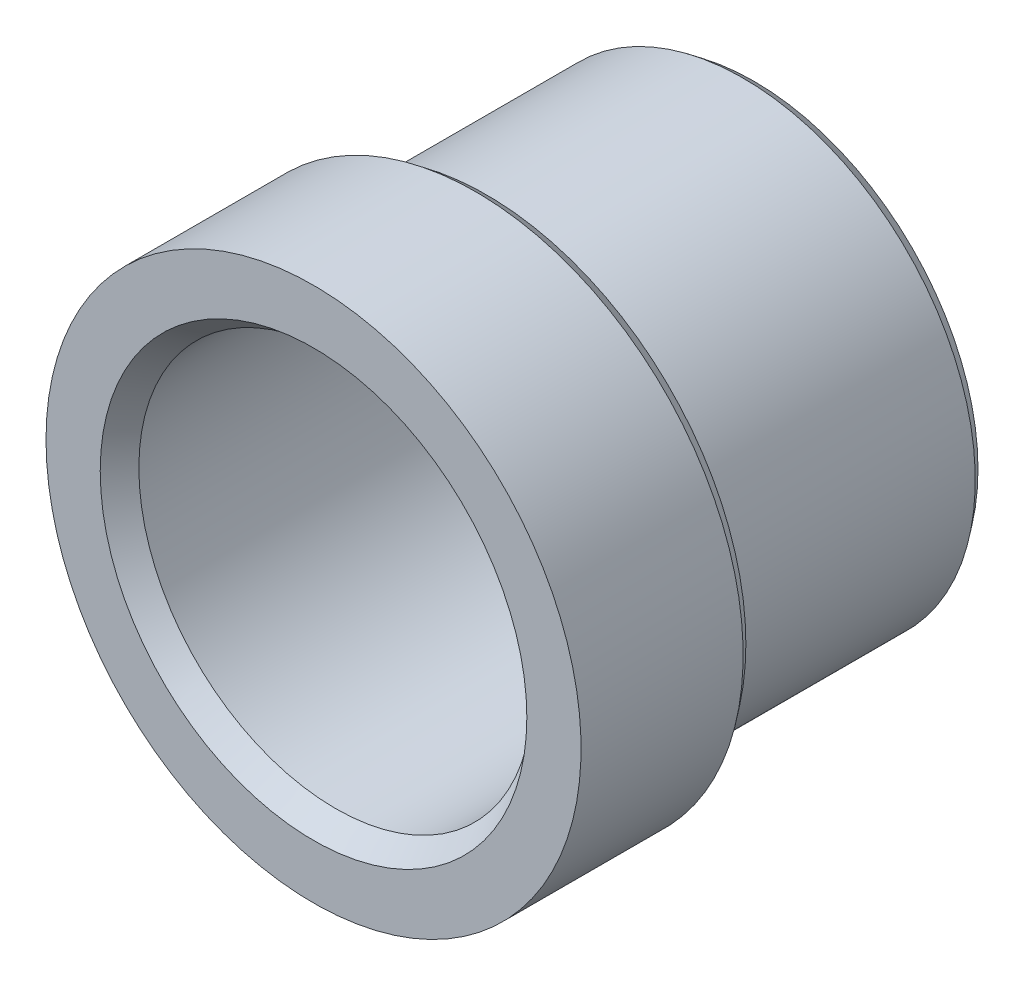
ISO-10303-21;
HEADER;
FILE_DESCRIPTION(('STEP AP214'),'2;1');
FILE_NAME('part.step','',(''),(''),'','','');
FILE_SCHEMA(('AUTOMOTIVE_DESIGN { 1 0 10303 214 1 1 1 1 }'));
ENDSEC;
DATA;
#1=APPLICATION_CONTEXT('core data for automotive mechanical design processes');
#2=APPLICATION_PROTOCOL_DEFINITION('international standard','automotive_design',2000,#1);
#3=PRODUCT_CONTEXT('',#1,'mechanical');
#4=PRODUCT('Part','Part','',(#3));
#5=PRODUCT_RELATED_PRODUCT_CATEGORY('part','',(#4));
#6=PRODUCT_DEFINITION_FORMATION('','',#4);
#7=PRODUCT_DEFINITION_CONTEXT('part definition',#1,'design');
#8=PRODUCT_DEFINITION('design','',#6,#7);
#9=PRODUCT_DEFINITION_SHAPE('','',#8);
#10=(LENGTH_UNIT() NAMED_UNIT(*) SI_UNIT(.MILLI.,.METRE.));
#11=(NAMED_UNIT(*) PLANE_ANGLE_UNIT() SI_UNIT($,.RADIAN.));
#12=(NAMED_UNIT(*) SI_UNIT($,.STERADIAN.) SOLID_ANGLE_UNIT());
#13=UNCERTAINTY_MEASURE_WITH_UNIT(LENGTH_MEASURE(1.E-05),#10,'distance_accuracy_value','');
#14=(GEOMETRIC_REPRESENTATION_CONTEXT(3) GLOBAL_UNCERTAINTY_ASSIGNED_CONTEXT((#13)) GLOBAL_UNIT_ASSIGNED_CONTEXT((#10,
#11,#12)) REPRESENTATION_CONTEXT('',''));
#15=CARTESIAN_POINT('',(0.,0.,0.));
#16=DIRECTION('',(0.,0.,1.));
#17=DIRECTION('',(1.,0.,0.));
#18=AXIS2_PLACEMENT_3D('',#15,#16,#17);
#19=CARTESIAN_POINT('',(0.,0.,-7.112));
#20=DIRECTION('',(0.,0.,-1.));
#21=DIRECTION('',(-1.,0.,0.));
#22=AXIS2_PLACEMENT_3D('',#19,#20,#21);
#23=CYLINDRICAL_SURFACE('',#22,6.35);
#24=CARTESIAN_POINT('',(0.,0.,6.4008));
#25=DIRECTION('',(0.,0.,1.));
#26=DIRECTION('',(1.,0.,0.));
#27=AXIS2_PLACEMENT_3D('',#24,#25,#26);
#28=CIRCLE('',#27,6.35);
#29=CARTESIAN_POINT('',(6.35,0.,6.4008));
#30=VERTEX_POINT('',#29);
#31=EDGE_CURVE('E70',#30,#30,#28,.T.);
#32=ORIENTED_EDGE('',*,*,#31,.T.);
#33=EDGE_LOOP('',(#32));
#34=FACE_BOUND('',#33,.T.);
#35=CARTESIAN_POINT('',(0.,0.,-7.112));
#36=DIRECTION('',(0.,0.,-1.));
#37=DIRECTION('',(-1.,0.,0.));
#38=AXIS2_PLACEMENT_3D('',#35,#36,#37);
#39=CIRCLE('',#38,6.35);
#40=CARTESIAN_POINT('',(-6.35,0.,-7.112));
#41=VERTEX_POINT('',#40);
#42=EDGE_CURVE('E76',#41,#41,#39,.T.);
#43=ORIENTED_EDGE('',*,*,#42,.T.);
#44=EDGE_LOOP('',(#43));
#45=FACE_BOUND('',#44,.T.);
#46=ADVANCED_FACE('F50',(#34,#45),#23,.F.);
#47=CARTESIAN_POINT('',(0.,6.35,-7.112));
#48=DIRECTION('',(0.,0.,-1.));
#49=DIRECTION('',(-1.,0.,0.));
#50=AXIS2_PLACEMENT_3D('',#47,#48,#49);
#51=PLANE('',#50);
#52=CARTESIAN_POINT('',(0.,0.,-7.112));
#53=DIRECTION('',(0.,0.,-1.));
#54=DIRECTION('',(-1.,0.,0.));
#55=AXIS2_PLACEMENT_3D('',#52,#53,#54);
#56=CIRCLE('',#55,7.22503617978346);
#57=CARTESIAN_POINT('',(-7.22503617978346,0.,-7.112));
#58=VERTEX_POINT('',#57);
#59=EDGE_CURVE('E65',#58,#58,#56,.T.);
#60=ORIENTED_EDGE('',*,*,#59,.T.);
#61=EDGE_LOOP('',(#60));
#62=FACE_BOUND('',#61,.T.);
#63=ORIENTED_EDGE('',*,*,#42,.F.);
#64=EDGE_LOOP('',(#63));
#65=FACE_BOUND('',#64,.T.);
#66=ADVANCED_FACE('F103',(#62,#65),#51,.T.);
#67=CARTESIAN_POINT('',(0.,0.,-7.112));
#68=DIRECTION('',(0.,0.,-1.));
#69=DIRECTION('',(-1.,0.,0.));
#70=AXIS2_PLACEMENT_3D('',#67,#68,#69);
#71=CYLINDRICAL_SURFACE('',#70,7.493);
#72=CARTESIAN_POINT('',(0.,0.,-6.75640000000001));
#73=DIRECTION('',(0.,0.,-1.));
#74=DIRECTION('',(-1.,0.,0.));
#75=AXIS2_PLACEMENT_3D('',#72,#73,#74);
#76=CIRCLE('',#75,7.493);
#77=CARTESIAN_POINT('',(-7.493,0.,-6.75640000000001));
#78=VERTEX_POINT('',#77);
#79=EDGE_CURVE('E61',#78,#78,#76,.F.);
#80=ORIENTED_EDGE('',*,*,#79,.T.);
#81=EDGE_LOOP('',(#80));
#82=FACE_BOUND('',#81,.T.);
#83=CARTESIAN_POINT('',(0.,0.,1.524));
#84=DIRECTION('',(0.,0.,-1.));
#85=DIRECTION('',(-1.,0.,0.));
#86=AXIS2_PLACEMENT_3D('',#83,#84,#85);
#87=CIRCLE('',#86,7.493);
#88=CARTESIAN_POINT('',(-7.493,0.,1.524));
#89=VERTEX_POINT('',#88);
#90=EDGE_CURVE('E79',#89,#89,#87,.T.);
#91=ORIENTED_EDGE('',*,*,#90,.T.);
#92=EDGE_LOOP('',(#91));
#93=FACE_BOUND('',#92,.T.);
#94=ADVANCED_FACE('F109',(#82,#93),#71,.T.);
#95=CARTESIAN_POINT('',(0.,7.493,1.524));
#96=DIRECTION('',(0.,0.,-1.));
#97=DIRECTION('',(-1.,0.,0.));
#98=AXIS2_PLACEMENT_3D('',#95,#96,#97);
#99=PLANE('',#98);
#100=CARTESIAN_POINT('',(0.,0.,1.524));
#101=DIRECTION('',(0.,0.,-1.));
#102=DIRECTION('',(-1.,0.,0.));
#103=AXIS2_PLACEMENT_3D('',#100,#101,#102);
#104=CIRCLE('',#103,8.36803617978344);
#105=CARTESIAN_POINT('',(-8.36803617978344,0.,1.524));
#106=VERTEX_POINT('',#105);
#107=EDGE_CURVE('E57',#106,#106,#104,.T.);
#108=ORIENTED_EDGE('',*,*,#107,.T.);
#109=EDGE_LOOP('',(#108));
#110=FACE_BOUND('',#109,.T.);
#111=ORIENTED_EDGE('',*,*,#90,.F.);
#112=EDGE_LOOP('',(#111));
#113=FACE_BOUND('',#112,.T.);
#114=ADVANCED_FACE('F100',(#110,#113),#99,.T.);
#115=CARTESIAN_POINT('',(0.,0.,-7.112));
#116=DIRECTION('',(0.,0.,-1.));
#117=DIRECTION('',(-1.,0.,0.));
#118=AXIS2_PLACEMENT_3D('',#115,#116,#117);
#119=CYLINDRICAL_SURFACE('',#118,8.636);
#120=CARTESIAN_POINT('',(0.,0.,1.87960000000001));
#121=DIRECTION('',(0.,0.,-1.));
#122=DIRECTION('',(-1.,0.,0.));
#123=AXIS2_PLACEMENT_3D('',#120,#121,#122);
#124=CIRCLE('',#123,8.636);
#125=CARTESIAN_POINT('',(-8.636,0.,1.87960000000001));
#126=VERTEX_POINT('',#125);
#127=EDGE_CURVE('E11',#126,#126,#124,.F.);
#128=ORIENTED_EDGE('',*,*,#127,.T.);
#129=EDGE_LOOP('',(#128));
#130=FACE_BOUND('',#129,.T.);
#131=CARTESIAN_POINT('',(0.,0.,7.112));
#132=DIRECTION('',(0.,0.,-1.));
#133=DIRECTION('',(-1.,0.,0.));
#134=AXIS2_PLACEMENT_3D('',#131,#132,#133);
#135=CIRCLE('',#134,8.636);
#136=CARTESIAN_POINT('',(-8.636,0.,7.112));
#137=VERTEX_POINT('',#136);
#138=EDGE_CURVE('E82',#137,#137,#135,.T.);
#139=ORIENTED_EDGE('',*,*,#138,.T.);
#140=EDGE_LOOP('',(#139));
#141=FACE_BOUND('',#140,.T.);
#142=ADVANCED_FACE('F86',(#130,#141),#119,.T.);
#143=CARTESIAN_POINT('',(0.,8.636,7.112));
#144=DIRECTION('',(0.,0.,1.));
#145=DIRECTION('',(1.,0.,0.));
#146=AXIS2_PLACEMENT_3D('',#143,#144,#145);
#147=PLANE('',#146);
#148=CARTESIAN_POINT('',(0.,0.,7.112));
#149=DIRECTION('',(0.,0.,1.));
#150=DIRECTION('',(1.,0.,0.));
#151=AXIS2_PLACEMENT_3D('',#148,#149,#150);
#152=CIRCLE('',#151,6.88592764043311);
#153=CARTESIAN_POINT('',(6.88592764043311,0.,7.112));
#154=VERTEX_POINT('',#153);
#155=EDGE_CURVE('E73',#154,#154,#152,.F.);
#156=ORIENTED_EDGE('',*,*,#155,.T.);
#157=EDGE_LOOP('',(#156));
#158=FACE_BOUND('',#157,.T.);
#159=ORIENTED_EDGE('',*,*,#138,.F.);
#160=EDGE_LOOP('',(#159));
#161=FACE_BOUND('',#160,.T.);
#162=ADVANCED_FACE('F88',(#158,#161),#147,.T.);
#163=CARTESIAN_POINT('',(0.,0.,7.112));
#164=DIRECTION('',(0.,0.,1.));
#165=DIRECTION('',(1.,0.,0.));
#166=AXIS2_PLACEMENT_3D('',#163,#164,#165);
#167=CONICAL_SURFACE('',#166,6.88592764043311,0.6457718232379);
#168=ORIENTED_EDGE('',*,*,#31,.F.);
#169=EDGE_LOOP('',(#168));
#170=FACE_BOUND('',#169,.T.);
#171=ORIENTED_EDGE('',*,*,#155,.F.);
#172=EDGE_LOOP('',(#171));
#173=FACE_BOUND('',#172,.T.);
#174=ADVANCED_FACE('F90',(#170,#173),#167,.F.);
#175=CARTESIAN_POINT('',(0.,0.,-7.112));
#176=DIRECTION('',(0.,0.,1.));
#177=DIRECTION('',(1.,0.,0.));
#178=AXIS2_PLACEMENT_3D('',#175,#176,#177);
#179=CONICAL_SURFACE('',#178,7.22503617978346,0.645771823237904);
#180=ORIENTED_EDGE('',*,*,#79,.F.);
#181=EDGE_LOOP('',(#180));
#182=FACE_BOUND('',#181,.T.);
#183=ORIENTED_EDGE('',*,*,#59,.F.);
#184=EDGE_LOOP('',(#183));
#185=FACE_BOUND('',#184,.T.);
#186=ADVANCED_FACE('F97',(#182,#185),#179,.T.);
#187=CARTESIAN_POINT('',(0.,0.,1.524));
#188=DIRECTION('',(0.,0.,1.));
#189=DIRECTION('',(1.,0.,0.));
#190=AXIS2_PLACEMENT_3D('',#187,#188,#189);
#191=CONICAL_SURFACE('',#190,8.36803617978344,0.645771823237902);
#192=ORIENTED_EDGE('',*,*,#127,.F.);
#193=EDGE_LOOP('',(#192));
#194=FACE_BOUND('',#193,.T.);
#195=ORIENTED_EDGE('',*,*,#107,.F.);
#196=EDGE_LOOP('',(#195));
#197=FACE_BOUND('',#196,.T.);
#198=ADVANCED_FACE('F52',(#194,#197),#191,.T.);
#199=CLOSED_SHELL('',(#46,#66,#94,#114,#142,#162,#174,#186,#198));
#200=MANIFOLD_SOLID_BREP('B2',#199);
#201=ADVANCED_BREP_SHAPE_REPRESENTATION('',(#18,#200),#14);
#202=SHAPE_DEFINITION_REPRESENTATION(#9,#201);
ENDSEC;
END-ISO-10303-21;
